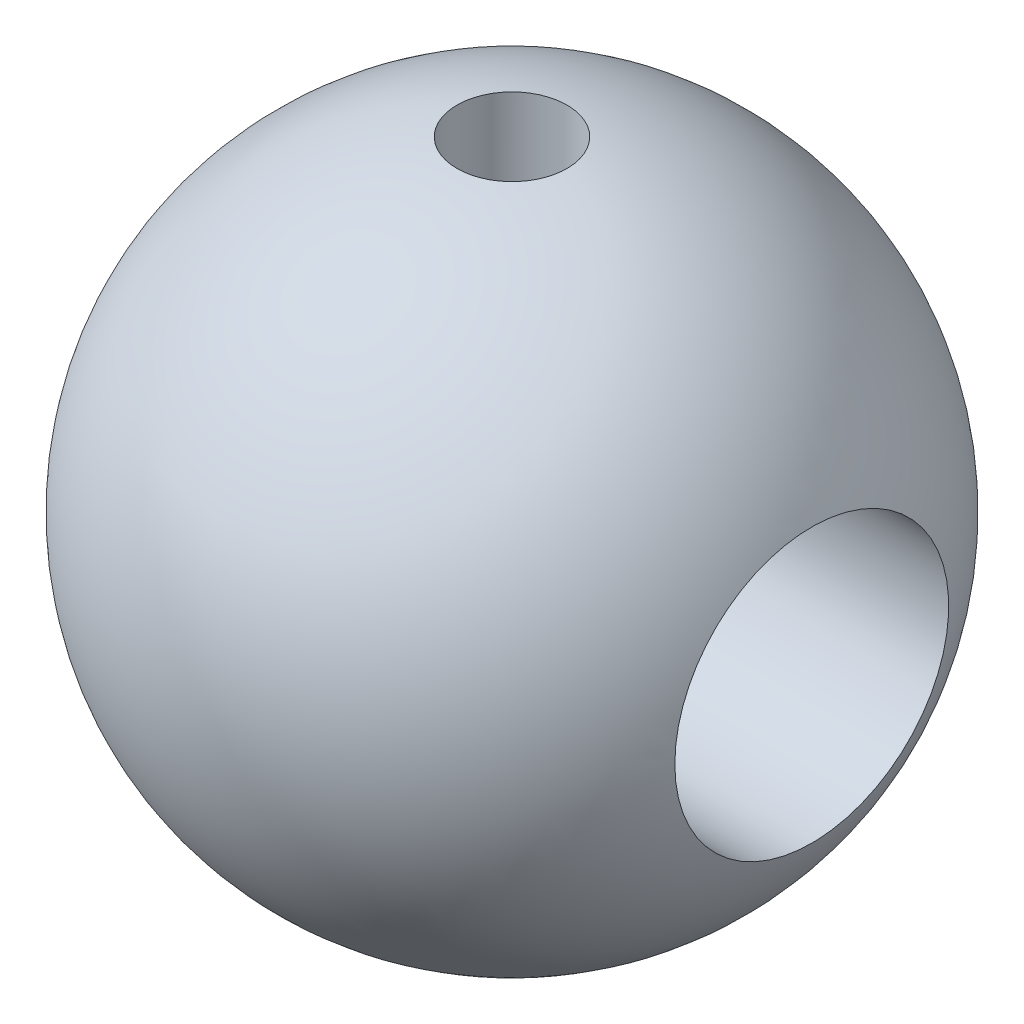
ISO-10303-21;
HEADER;
FILE_DESCRIPTION(('STEP AP214'),'2;1');
FILE_NAME('part.step','',(''),(''),'','','');
FILE_SCHEMA(('AUTOMOTIVE_DESIGN { 1 0 10303 214 1 1 1 1 }'));
ENDSEC;
DATA;
#1=APPLICATION_CONTEXT('core data for automotive mechanical design processes');
#2=APPLICATION_PROTOCOL_DEFINITION('international standard','automotive_design',2000,#1);
#3=PRODUCT_CONTEXT('',#1,'mechanical');
#4=PRODUCT('Part','Part','',(#3));
#5=PRODUCT_RELATED_PRODUCT_CATEGORY('part','',(#4));
#6=PRODUCT_DEFINITION_FORMATION('','',#4);
#7=PRODUCT_DEFINITION_CONTEXT('part definition',#1,'design');
#8=PRODUCT_DEFINITION('design','',#6,#7);
#9=PRODUCT_DEFINITION_SHAPE('','',#8);
#10=(LENGTH_UNIT() NAMED_UNIT(*) SI_UNIT(.MILLI.,.METRE.));
#11=(NAMED_UNIT(*) PLANE_ANGLE_UNIT() SI_UNIT($,.RADIAN.));
#12=(NAMED_UNIT(*) SI_UNIT($,.STERADIAN.) SOLID_ANGLE_UNIT());
#13=UNCERTAINTY_MEASURE_WITH_UNIT(LENGTH_MEASURE(1.E-05),#10,'distance_accuracy_value','');
#14=(GEOMETRIC_REPRESENTATION_CONTEXT(3) GLOBAL_UNCERTAINTY_ASSIGNED_CONTEXT((#13)) GLOBAL_UNIT_ASSIGNED_CONTEXT((#10,
#11,#12)) REPRESENTATION_CONTEXT('',''));
#15=CARTESIAN_POINT('',(0.,0.,0.));
#16=DIRECTION('',(0.,0.,1.));
#17=DIRECTION('',(1.,0.,0.));
#18=AXIS2_PLACEMENT_3D('',#15,#16,#17);
#19=CARTESIAN_POINT('',(0.,0.,0.));
#20=DIRECTION('',(0.,1.,0.));
#21=DIRECTION('',(0.,0.,-1.));
#22=AXIS2_PLACEMENT_3D('',#19,#20,#21);
#23=SPHERICAL_SURFACE('',#22,9.53);
#24=CARTESIAN_POINT('',(0.,9.39642485203814,0.));
#25=DIRECTION('',(0.,1.,0.));
#26=DIRECTION('',(0.,0.,1.));
#27=AXIS2_PLACEMENT_3D('',#24,#25,#26);
#28=CIRCLE('',#27,1.59);
#29=CARTESIAN_POINT('',(0.,9.39642485203814,1.59));
#30=VERTEX_POINT('',#29);
#31=EDGE_CURVE('E10',#30,#30,#28,.T.);
#32=ORIENTED_EDGE('',*,*,#31,.F.);
#33=EDGE_LOOP('',(#32));
#34=FACE_BOUND('',#33,.T.);
#35=CARTESIAN_POINT('',(0.,-9.39642485203814,0.));
#36=DIRECTION('',(0.,1.,0.));
#37=DIRECTION('',(0.,0.,1.));
#38=AXIS2_PLACEMENT_3D('',#35,#36,#37);
#39=CIRCLE('',#38,1.59);
#40=CARTESIAN_POINT('',(0.,-9.39642485203814,1.59));
#41=VERTEX_POINT('',#40);
#42=EDGE_CURVE('E42',#41,#41,#39,.T.);
#43=ORIENTED_EDGE('',*,*,#42,.T.);
#44=EDGE_LOOP('',(#43));
#45=FACE_BOUND('',#44,.T.);
#46=CARTESIAN_POINT('',(8.66829279616234,0.,0.));
#47=DIRECTION('',(-1.,0.,0.));
#48=DIRECTION('',(0.,0.,1.));
#49=AXIS2_PLACEMENT_3D('',#46,#47,#48);
#50=CIRCLE('',#49,3.96);
#51=CARTESIAN_POINT('',(8.66829279616234,0.,3.96));
#52=VERTEX_POINT('',#51);
#53=EDGE_CURVE('E79',#52,#52,#50,.F.);
#54=ORIENTED_EDGE('',*,*,#53,.F.);
#55=EDGE_LOOP('',(#54));
#56=FACE_BOUND('',#55,.T.);
#57=CARTESIAN_POINT('',(-8.66829279616234,0.,0.));
#58=DIRECTION('',(1.,0.,0.));
#59=DIRECTION('',(0.,0.,-1.));
#60=AXIS2_PLACEMENT_3D('',#57,#58,#59);
#61=CIRCLE('',#60,3.96);
#62=CARTESIAN_POINT('',(-8.66829279616234,0.,-3.96));
#63=VERTEX_POINT('',#62);
#64=EDGE_CURVE('E47',#63,#63,#61,.F.);
#65=ORIENTED_EDGE('',*,*,#64,.F.);
#66=EDGE_LOOP('',(#65));
#67=FACE_BOUND('',#66,.T.);
#68=ADVANCED_FACE('F31',(#34,#45,#56,#67),#23,.T.);
#69=CARTESIAN_POINT('',(0.,11.5280420454546,0.));
#70=DIRECTION('',(0.,1.,0.));
#71=DIRECTION('',(0.,0.,1.));
#72=AXIS2_PLACEMENT_3D('',#69,#70,#71);
#73=CYLINDRICAL_SURFACE('',#72,1.59);
#74=ORIENTED_EDGE('',*,*,#42,.F.);
#75=EDGE_LOOP('',(#74));
#76=FACE_BOUND('',#75,.T.);
#77=CARTESIAN_POINT('',(0.,-3.62677542729075,1.59));
#78=CARTESIAN_POINT('',(-0.0851163008795201,-3.62678298759535,1.58999195078685));
#79=CARTESIAN_POINT('',(-0.170383687387572,-3.62981507705667,1.58312219250491));
#80=CARTESIAN_POINT('',(-0.3384762481055,-3.64156293360954,1.55590022664081));
#81=CARTESIAN_POINT('',(-0.421293897714875,-3.65029462598056,1.53551023960799));
#82=CARTESIAN_POINT('',(-0.581760230476496,-3.67228125377669,1.48215152891577));
#83=CARTESIAN_POINT('',(-0.65942760693234,-3.68551862467545,1.44923159281702));
#84=CARTESIAN_POINT('',(-0.808112348337178,-3.71499983925612,1.37188989980722));
#85=CARTESIAN_POINT('',(-0.87913161024845,-3.73124282135983,1.32747143757207));
#86=CARTESIAN_POINT('',(-1.01664791267899,-3.76595452485307,1.22565191327523));
#87=CARTESIAN_POINT('',(-1.08271425556293,-3.78449521993051,1.16769340941828));
#88=CARTESIAN_POINT('',(-1.20450509663388,-3.82111930885842,1.0416113765069));
#89=CARTESIAN_POINT('',(-1.26022577003817,-3.83920253145625,0.973484104794365));
#90=CARTESIAN_POINT('',(-1.36188408953179,-3.87373830208315,0.825668950713795));
#91=CARTESIAN_POINT('',(-1.40734449571678,-3.89009738856802,0.745629040077279));
#92=CARTESIAN_POINT('',(-1.48397152861288,-3.91846895609392,0.578263574542511));
#93=CARTESIAN_POINT('',(-1.51514407211395,-3.93048323594027,0.490941053207266));
#94=CARTESIAN_POINT('',(-1.56077216564697,-3.94830218011608,0.316003617767929));
#95=CARTESIAN_POINT('',(-1.57596842252531,-3.95438095044113,0.228610380252791));
#96=CARTESIAN_POINT('',(-1.59159843425854,-3.96063514526383,0.0523170355787136));
#97=CARTESIAN_POINT('',(-1.59203772885368,-3.96081278503627,-0.0365824935813469));
#98=CARTESIAN_POINT('',(-1.57854580739952,-3.95541101049953,-0.208007720908713));
#99=CARTESIAN_POINT('',(-1.56542639633773,-3.95015681283276,-0.290609423787395));
#100=CARTESIAN_POINT('',(-1.52657126838152,-3.93492083798518,-0.452324248684608));
#101=CARTESIAN_POINT('',(-1.50083462585742,-3.92493871395443,-0.531437114289663));
#102=CARTESIAN_POINT('',(-1.43716025797265,-3.90103175818298,-0.685356914161422));
#103=CARTESIAN_POINT('',(-1.3990442348849,-3.88704969002319,-0.76008083160297));
#104=CARTESIAN_POINT('',(-1.31186080370913,-3.85652869017187,-0.90226506368188));
#105=CARTESIAN_POINT('',(-1.26278963043605,-3.83998888000983,-0.9697228691776));
#106=CARTESIAN_POINT('',(-1.15130964941949,-3.804738993193,-1.10019371649987));
#107=CARTESIAN_POINT('',(-1.08823367868957,-3.78595772770335,-1.16261832431588));
#108=CARTESIAN_POINT('',(-0.952437957098417,-3.74918266451347,-1.27624601729864));
#109=CARTESIAN_POINT('',(-0.879715013640179,-3.73118913014062,-1.32744537260276));
#110=CARTESIAN_POINT('',(-0.724039121125993,-3.69754046729277,-1.41852965971939));
#111=CARTESIAN_POINT('',(-0.640852795404823,-3.68196709232658,-1.45804845557621));
#112=CARTESIAN_POINT('',(-0.468214155810735,-3.65588201320998,-1.52228214928927));
#113=CARTESIAN_POINT('',(-0.378765991432419,-3.6453669927683,-1.54700674892019));
#114=CARTESIAN_POINT('',(-0.202015223809765,-3.63139570717007,-1.57951296663874));
#115=CARTESIAN_POINT('',(-0.114918483783495,-3.62754542476669,-1.58824227796941));
#116=CARTESIAN_POINT('',(0.0595614608863808,-3.62621666083514,-1.59127586215782));
#117=CARTESIAN_POINT('',(0.146944569397182,-3.62873622391322,-1.58558456180527));
#118=CARTESIAN_POINT('',(0.3142264516949,-3.63945863715613,-1.56080153217723));
#119=CARTESIAN_POINT('',(0.394266477251,-3.64732593338939,-1.5425001671102));
#120=CARTESIAN_POINT('',(0.550085485691302,-3.6674399981933,-1.49404381769741));
#121=CARTESIAN_POINT('',(0.625863514781826,-3.67968774258854,-1.46388619200506));
#122=CARTESIAN_POINT('',(0.774449702267128,-3.70779274404468,-1.39120293990302));
#123=CARTESIAN_POINT('',(0.847011223954808,-3.72377668785942,-1.3482236341883));
#124=CARTESIAN_POINT('',(0.984224024756996,-3.7573610951886,-1.25157971766847));
#125=CARTESIAN_POINT('',(1.04887204691966,-3.77496221910202,-1.1979107310354));
#126=CARTESIAN_POINT('',(1.17343165850692,-3.81138175144335,-1.07668918121797));
#127=CARTESIAN_POINT('',(1.2326311103257,-3.83019311186344,-1.00839997921709));
#128=CARTESIAN_POINT('',(1.33884227407518,-3.86568080642493,-0.862408571448089));
#129=CARTESIAN_POINT('',(1.38585345264877,-3.88235704711762,-0.784705953968486));
#130=CARTESIAN_POINT('',(1.46618996817809,-3.91175301589417,-0.621796205927504));
#131=CARTESIAN_POINT('',(1.49951541012242,-3.92447277432956,-0.536589132941811));
#132=CARTESIAN_POINT('',(1.55113698204897,-3.94448395625395,-0.361141335505479));
#133=CARTESIAN_POINT('',(1.56944134770793,-3.95177835412537,-0.270903398374162));
#134=CARTESIAN_POINT('',(1.58951866011002,-3.95979718360758,-0.0943465402302849));
#135=CARTESIAN_POINT('',(1.59229823784627,-3.96092158806393,-0.00815938553605667));
#136=CARTESIAN_POINT('',(1.58390964704543,-3.9575565819137,0.163412317398945));
#137=CARTESIAN_POINT('',(1.57274362665173,-3.95306803591116,0.248796987211362));
#138=CARTESIAN_POINT('',(1.53750067077526,-3.93918253154566,0.413613134601733));
#139=CARTESIAN_POINT('',(1.51383657272835,-3.92994275990294,0.49314719541705));
#140=CARTESIAN_POINT('',(1.45470410222242,-3.90754623467457,0.647101138369535));
#141=CARTESIAN_POINT('',(1.41923340998763,-3.89438871137733,0.721520011998115));
#142=CARTESIAN_POINT('',(1.33572409500583,-3.864721299715,0.866756555331418));
#143=CARTESIAN_POINT('',(1.28719803444916,-3.84808865595822,0.937268332309587));
#144=CARTESIAN_POINT('',(1.17968727404167,-3.813472746772,1.06943963801552));
#145=CARTESIAN_POINT('',(1.12069905683964,-3.7954890282903,1.13109617697811));
#146=CARTESIAN_POINT('',(0.989592109103815,-3.75880212876851,1.24778992956168));
#147=CARTESIAN_POINT('',(0.916884330994993,-3.74012391654668,1.30217553401349));
#148=CARTESIAN_POINT('',(0.762760680791442,-3.70535843178243,1.39804531442304));
#149=CARTESIAN_POINT('',(0.681340137221687,-3.68927256086084,1.4395225223093));
#150=CARTESIAN_POINT('',(0.512686366430946,-3.66189731992592,1.50779852377964));
#151=CARTESIAN_POINT('',(0.425513691535073,-3.65056507026092,1.53472919862279));
#152=CARTESIAN_POINT('',(0.247450621211858,-3.63413674472206,1.57324752767344));
#153=CARTESIAN_POINT('',(0.156573768135749,-3.62901974784891,1.58488666518809));
#154=CARTESIAN_POINT('',(0.0436723718771774,-3.62697069883915,1.58955231843662));
#155=CARTESIAN_POINT('',(0.0218411600909298,-3.62677348728841,1.5900020654581));
#156=CARTESIAN_POINT('',(0.,-3.62677542729075,1.59));
#157=B_SPLINE_CURVE_WITH_KNOTS('',3,(#77,#78,#79,#80,#81,#82,#83,#84,#85,#86,#87,#88,#89,#90,
#91,#92,#93,#94,#95,#96,#97,#98,#99,#100,#101,#102,#103,#104,#105,#106,#107,#108,#109,#110,#111,
#112,#113,#114,#115,#116,#117,#118,#119,#120,#121,#122,#123,#124,#125,#126,#127,#128,#129,#130,
#131,#132,#133,#134,#135,#136,#137,#138,#139,#140,#141,#142,#143,#144,#145,#146,#147,#148,#149,
#150,#151,#152,#153,#154,#155,#156),.UNSPECIFIED.,.T.,.F.,(4,2,2,2,2,2,2,2,2,2,2,2,2,2,2,2,2,2,
2,2,2,2,2,2,2,2,2,2,2,2,2,2,2,2,2,2,2,2,2,4),(0.,0.25529006061148,0.511296499083923,
0.766316163095068,1.02126283697459,1.28954166836764,1.55791948551857,1.83697140859004,
2.11590766798773,2.38124911057845,2.64649094329843,2.8967230259443,3.14697346895015,
3.40100115122496,3.65511627527116,3.92602646568735,4.19702653662425,4.47578984928089,
4.75437015291682,5.0158335070881,5.27721660786417,5.52355116179761,5.7699406254532,
6.02636454041952,6.28289363921607,6.55854237922545,6.83420317954947,7.10986186513281,
7.38536931285348,7.64278513845775,7.90016131729305,8.14952348564655,8.39893467796963,
8.65940244424661,8.9199579457112,9.19674456629127,9.47368034071757,9.74806133040632,
10.021516150881,10.0870245320703),.UNSPECIFIED.);
#158=CARTESIAN_POINT('',(0.,-3.62677542729075,1.59));
#159=VERTEX_POINT('',#158);
#160=EDGE_CURVE('E34',#159,#159,#157,.T.);
#161=ORIENTED_EDGE('',*,*,#160,.F.);
#162=EDGE_LOOP('',(#161));
#163=FACE_BOUND('',#162,.T.);
#164=ADVANCED_FACE('F55',(#76,#163),#73,.F.);
#165=ORIENTED_EDGE('',*,*,#31,.T.);
#166=EDGE_LOOP('',(#165));
#167=FACE_BOUND('',#166,.T.);
#168=CARTESIAN_POINT('',(0.,3.62677542729075,1.59));
#169=CARTESIAN_POINT('',(0.0851163008795201,3.62678298759535,1.58999195078685));
#170=CARTESIAN_POINT('',(0.170383687387572,3.62981507705667,1.58312219250491));
#171=CARTESIAN_POINT('',(0.3384762481055,3.64156293360954,1.55590022664081));
#172=CARTESIAN_POINT('',(0.421293897714875,3.65029462598056,1.53551023960799));
#173=CARTESIAN_POINT('',(0.581760230476496,3.67228125377669,1.48215152891577));
#174=CARTESIAN_POINT('',(0.65942760693234,3.68551862467545,1.44923159281702));
#175=CARTESIAN_POINT('',(0.808112348337178,3.71499983925612,1.37188989980722));
#176=CARTESIAN_POINT('',(0.87913161024845,3.73124282135983,1.32747143757207));
#177=CARTESIAN_POINT('',(1.01664791267899,3.76595452485307,1.22565191327523));
#178=CARTESIAN_POINT('',(1.08271425556293,3.78449521993051,1.16769340941828));
#179=CARTESIAN_POINT('',(1.20450509663388,3.82111930885842,1.0416113765069));
#180=CARTESIAN_POINT('',(1.26022577003817,3.83920253145625,0.973484104794365));
#181=CARTESIAN_POINT('',(1.36188408953179,3.87373830208315,0.825668950713795));
#182=CARTESIAN_POINT('',(1.40734449571678,3.89009738856802,0.745629040077279));
#183=CARTESIAN_POINT('',(1.48397152861288,3.91846895609392,0.578263574542511));
#184=CARTESIAN_POINT('',(1.51514407211395,3.93048323594027,0.490941053207266));
#185=CARTESIAN_POINT('',(1.56077216564697,3.94830218011608,0.316003617767929));
#186=CARTESIAN_POINT('',(1.57596842252531,3.95438095044113,0.228610380252791));
#187=CARTESIAN_POINT('',(1.59159843425854,3.96063514526383,0.0523170355787136));
#188=CARTESIAN_POINT('',(1.59203772885368,3.96081278503627,-0.0365824935813469));
#189=CARTESIAN_POINT('',(1.57854580739952,3.95541101049953,-0.208007720908713));
#190=CARTESIAN_POINT('',(1.56542639633773,3.95015681283276,-0.290609423787395));
#191=CARTESIAN_POINT('',(1.52657126838152,3.93492083798518,-0.452324248684608));
#192=CARTESIAN_POINT('',(1.50083462585742,3.92493871395443,-0.531437114289663));
#193=CARTESIAN_POINT('',(1.43716025797265,3.90103175818298,-0.685356914161422));
#194=CARTESIAN_POINT('',(1.3990442348849,3.88704969002319,-0.76008083160297));
#195=CARTESIAN_POINT('',(1.31186080370913,3.85652869017187,-0.90226506368188));
#196=CARTESIAN_POINT('',(1.26278963043605,3.83998888000983,-0.9697228691776));
#197=CARTESIAN_POINT('',(1.15130964941949,3.804738993193,-1.10019371649987));
#198=CARTESIAN_POINT('',(1.08823367868957,3.78595772770335,-1.16261832431588));
#199=CARTESIAN_POINT('',(0.952437957098417,3.74918266451347,-1.27624601729864));
#200=CARTESIAN_POINT('',(0.879715013640179,3.73118913014062,-1.32744537260276));
#201=CARTESIAN_POINT('',(0.724039121125993,3.69754046729277,-1.41852965971939));
#202=CARTESIAN_POINT('',(0.640852795404823,3.68196709232658,-1.45804845557621));
#203=CARTESIAN_POINT('',(0.468214155810735,3.65588201320998,-1.52228214928927));
#204=CARTESIAN_POINT('',(0.378765991432419,3.6453669927683,-1.54700674892019));
#205=CARTESIAN_POINT('',(0.202015223809765,3.63139570717007,-1.57951296663874));
#206=CARTESIAN_POINT('',(0.114918483783495,3.62754542476669,-1.58824227796941));
#207=CARTESIAN_POINT('',(-0.0595614608863808,3.62621666083514,-1.59127586215782));
#208=CARTESIAN_POINT('',(-0.146944569397182,3.62873622391322,-1.58558456180527));
#209=CARTESIAN_POINT('',(-0.3142264516949,3.63945863715613,-1.56080153217723));
#210=CARTESIAN_POINT('',(-0.394266477251,3.64732593338939,-1.5425001671102));
#211=CARTESIAN_POINT('',(-0.550085485691302,3.6674399981933,-1.49404381769741));
#212=CARTESIAN_POINT('',(-0.625863514781826,3.67968774258854,-1.46388619200506));
#213=CARTESIAN_POINT('',(-0.774449702267128,3.70779274404468,-1.39120293990302));
#214=CARTESIAN_POINT('',(-0.847011223954808,3.72377668785942,-1.3482236341883));
#215=CARTESIAN_POINT('',(-0.984224024756996,3.7573610951886,-1.25157971766847));
#216=CARTESIAN_POINT('',(-1.04887204691966,3.77496221910202,-1.1979107310354));
#217=CARTESIAN_POINT('',(-1.17343165850692,3.81138175144335,-1.07668918121797));
#218=CARTESIAN_POINT('',(-1.2326311103257,3.83019311186344,-1.00839997921709));
#219=CARTESIAN_POINT('',(-1.33884227407518,3.86568080642493,-0.862408571448089));
#220=CARTESIAN_POINT('',(-1.38585345264877,3.88235704711762,-0.784705953968486));
#221=CARTESIAN_POINT('',(-1.46618996817809,3.91175301589417,-0.621796205927504));
#222=CARTESIAN_POINT('',(-1.49951541012242,3.92447277432956,-0.536589132941811));
#223=CARTESIAN_POINT('',(-1.55113698204897,3.94448395625395,-0.361141335505479));
#224=CARTESIAN_POINT('',(-1.56944134770793,3.95177835412537,-0.270903398374162));
#225=CARTESIAN_POINT('',(-1.58951866011002,3.95979718360758,-0.0943465402302849));
#226=CARTESIAN_POINT('',(-1.59229823784627,3.96092158806393,-0.00815938553605667));
#227=CARTESIAN_POINT('',(-1.58390964704543,3.9575565819137,0.163412317398945));
#228=CARTESIAN_POINT('',(-1.57274362665173,3.95306803591116,0.248796987211362));
#229=CARTESIAN_POINT('',(-1.53750067077526,3.93918253154566,0.413613134601733));
#230=CARTESIAN_POINT('',(-1.51383657272835,3.92994275990294,0.49314719541705));
#231=CARTESIAN_POINT('',(-1.45470410222242,3.90754623467457,0.647101138369535));
#232=CARTESIAN_POINT('',(-1.41923340998763,3.89438871137733,0.721520011998115));
#233=CARTESIAN_POINT('',(-1.33572409500583,3.864721299715,0.866756555331418));
#234=CARTESIAN_POINT('',(-1.28719803444916,3.84808865595822,0.937268332309587));
#235=CARTESIAN_POINT('',(-1.17968727404167,3.813472746772,1.06943963801552));
#236=CARTESIAN_POINT('',(-1.12069905683964,3.7954890282903,1.13109617697811));
#237=CARTESIAN_POINT('',(-0.989592109103815,3.75880212876851,1.24778992956168));
#238=CARTESIAN_POINT('',(-0.916884330994993,3.74012391654668,1.30217553401349));
#239=CARTESIAN_POINT('',(-0.762760680791442,3.70535843178243,1.39804531442304));
#240=CARTESIAN_POINT('',(-0.681340137221687,3.68927256086084,1.4395225223093));
#241=CARTESIAN_POINT('',(-0.512686366430946,3.66189731992592,1.50779852377964));
#242=CARTESIAN_POINT('',(-0.425513691535073,3.65056507026092,1.53472919862279));
#243=CARTESIAN_POINT('',(-0.247450621211858,3.63413674472206,1.57324752767344));
#244=CARTESIAN_POINT('',(-0.156573768135749,3.62901974784891,1.58488666518809));
#245=CARTESIAN_POINT('',(-0.0436723718771774,3.62697069883915,1.58955231843662));
#246=CARTESIAN_POINT('',(-0.0218411600909298,3.62677348728841,1.5900020654581));
#247=CARTESIAN_POINT('',(0.,3.62677542729075,1.59));
#248=B_SPLINE_CURVE_WITH_KNOTS('',3,(#168,#169,#170,#171,#172,#173,#174,#175,#176,#177,#178,
#179,#180,#181,#182,#183,#184,#185,#186,#187,#188,#189,#190,#191,#192,#193,#194,#195,#196,#197,
#198,#199,#200,#201,#202,#203,#204,#205,#206,#207,#208,#209,#210,#211,#212,#213,#214,#215,#216,
#217,#218,#219,#220,#221,#222,#223,#224,#225,#226,#227,#228,#229,#230,#231,#232,#233,#234,#235,
#236,#237,#238,#239,#240,#241,#242,#243,#244,#245,#246,#247),.UNSPECIFIED.,.T.,.F.,(4,2,2,2,2,2,
2,2,2,2,2,2,2,2,2,2,2,2,2,2,2,2,2,2,2,2,2,2,2,2,2,2,2,2,2,2,2,2,2,4),(0.,0.25529006061148,
0.511296499083923,0.766316163095068,1.02126283697459,1.28954166836764,1.55791948551857,
1.83697140859004,2.11590766798773,2.38124911057845,2.64649094329843,2.8967230259443,
3.14697346895015,3.40100115122496,3.65511627527116,3.92602646568735,4.19702653662425,
4.47578984928089,4.75437015291682,5.0158335070881,5.27721660786417,5.52355116179761,
5.7699406254532,6.02636454041952,6.28289363921607,6.55854237922545,6.83420317954947,
7.10986186513281,7.38536931285348,7.64278513845775,7.90016131729305,8.14952348564655,
8.39893467796963,8.65940244424661,8.9199579457112,9.19674456629127,9.47368034071757,
9.74806133040632,10.021516150881,10.0870245320703),.UNSPECIFIED.);
#249=CARTESIAN_POINT('',(0.,3.62677542729075,1.59));
#250=VERTEX_POINT('',#249);
#251=EDGE_CURVE('E50',#250,#250,#248,.T.);
#252=ORIENTED_EDGE('',*,*,#251,.F.);
#253=EDGE_LOOP('',(#252));
#254=FACE_BOUND('',#253,.T.);
#255=ADVANCED_FACE('F60',(#167,#254),#73,.F.);
#256=CARTESIAN_POINT('',(-12.7951317134136,0.,0.));
#257=DIRECTION('',(-1.,0.,0.));
#258=DIRECTION('',(0.,0.,1.));
#259=AXIS2_PLACEMENT_3D('',#256,#257,#258);
#260=CYLINDRICAL_SURFACE('',#259,3.96);
#261=ORIENTED_EDGE('',*,*,#53,.T.);
#262=EDGE_LOOP('',(#261));
#263=FACE_BOUND('',#262,.T.);
#264=ORIENTED_EDGE('',*,*,#251,.T.);
#265=EDGE_LOOP('',(#264));
#266=FACE_BOUND('',#265,.T.);
#267=ORIENTED_EDGE('',*,*,#160,.T.);
#268=EDGE_LOOP('',(#267));
#269=FACE_BOUND('',#268,.T.);
#270=ORIENTED_EDGE('',*,*,#64,.T.);
#271=EDGE_LOOP('',(#270));
#272=FACE_BOUND('',#271,.T.);
#273=ADVANCED_FACE('F57',(#263,#266,#269,#272),#260,.F.);
#274=CLOSED_SHELL('',(#68,#164,#255,#273));
#275=MANIFOLD_SOLID_BREP('B2',#274);
#276=ADVANCED_BREP_SHAPE_REPRESENTATION('',(#18,#275),#14);
#277=SHAPE_DEFINITION_REPRESENTATION(#9,#276);
ENDSEC;
END-ISO-10303-21;
